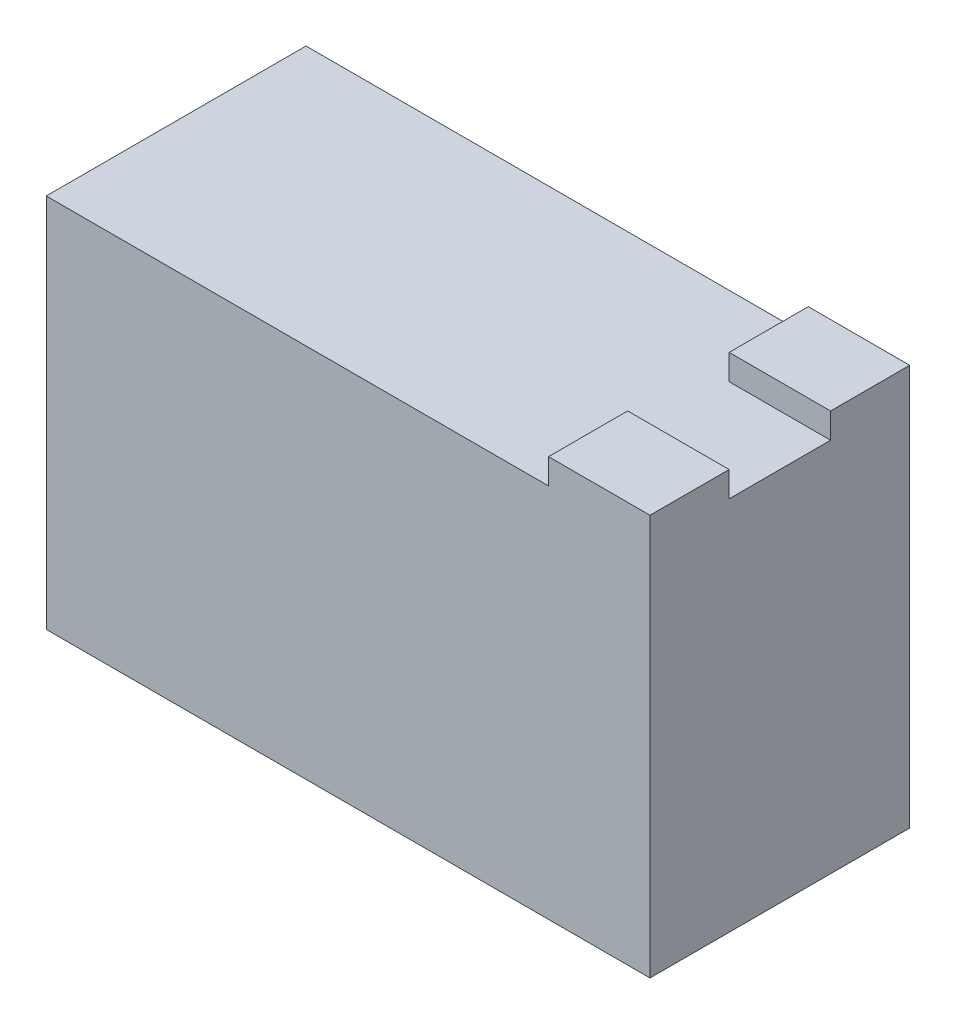
ISO-10303-21;
HEADER;
FILE_DESCRIPTION(('STEP AP214'),'2;1');
FILE_NAME('part.step','',(''),(''),'','','');
FILE_SCHEMA(('AUTOMOTIVE_DESIGN { 1 0 10303 214 1 1 1 1 }'));
ENDSEC;
DATA;
#1=APPLICATION_CONTEXT('core data for automotive mechanical design processes');
#2=APPLICATION_PROTOCOL_DEFINITION('international standard','automotive_design',2000,#1);
#3=PRODUCT_CONTEXT('',#1,'mechanical');
#4=PRODUCT('Part','Part','',(#3));
#5=PRODUCT_RELATED_PRODUCT_CATEGORY('part','',(#4));
#6=PRODUCT_DEFINITION_FORMATION('','',#4);
#7=PRODUCT_DEFINITION_CONTEXT('part definition',#1,'design');
#8=PRODUCT_DEFINITION('design','',#6,#7);
#9=PRODUCT_DEFINITION_SHAPE('','',#8);
#10=(LENGTH_UNIT() NAMED_UNIT(*) SI_UNIT(.MILLI.,.METRE.));
#11=(NAMED_UNIT(*) PLANE_ANGLE_UNIT() SI_UNIT($,.RADIAN.));
#12=(NAMED_UNIT(*) SI_UNIT($,.STERADIAN.) SOLID_ANGLE_UNIT());
#13=UNCERTAINTY_MEASURE_WITH_UNIT(LENGTH_MEASURE(1.E-05),#10,'distance_accuracy_value','');
#14=(GEOMETRIC_REPRESENTATION_CONTEXT(3) GLOBAL_UNCERTAINTY_ASSIGNED_CONTEXT((#13)) GLOBAL_UNIT_ASSIGNED_CONTEXT((#10,
#11,#12)) REPRESENTATION_CONTEXT('',''));
#15=CARTESIAN_POINT('',(0.,0.,0.));
#16=DIRECTION('',(0.,0.,1.));
#17=DIRECTION('',(1.,0.,0.));
#18=AXIS2_PLACEMENT_3D('',#15,#16,#17);
#19=CARTESIAN_POINT('',(0.,93.98,0.));
#20=DIRECTION('',(0.,1.,0.));
#21=DIRECTION('',(0.,0.,1.));
#22=AXIS2_PLACEMENT_3D('',#19,#20,#21);
#23=PLANE('',#22);
#24=DIRECTION('',(1.,0.,0.));
#25=VECTOR('',#24,1.);
#26=CARTESIAN_POINT('',(75.565,93.98,32.512));
#27=LINE('',#26,#25);
#28=CARTESIAN_POINT('',(-75.565,93.98,32.512));
#29=VERTEX_POINT('',#28);
#30=CARTESIAN_POINT('',(50.165,93.98,32.512));
#31=VERTEX_POINT('',#30);
#32=EDGE_CURVE('E218',#29,#31,#27,.T.);
#33=ORIENTED_EDGE('',*,*,#32,.T.);
#34=DIRECTION('',(0.,0.,1.));
#35=VECTOR('',#34,1.);
#36=CARTESIAN_POINT('',(50.165,93.98,12.7));
#37=LINE('',#36,#35);
#38=CARTESIAN_POINT('',(50.165,93.98,12.7));
#39=VERTEX_POINT('',#38);
#40=EDGE_CURVE('E135',#39,#31,#37,.T.);
#41=ORIENTED_EDGE('',*,*,#40,.F.);
#42=DIRECTION('',(-1.,0.,0.));
#43=VECTOR('',#42,1.);
#44=CARTESIAN_POINT('',(50.165,93.98,12.7));
#45=LINE('',#44,#43);
#46=CARTESIAN_POINT('',(75.565,93.98,12.7));
#47=VERTEX_POINT('',#46);
#48=EDGE_CURVE('E131',#47,#39,#45,.T.);
#49=ORIENTED_EDGE('',*,*,#48,.F.);
#50=DIRECTION('',(0.,0.,-1.));
#51=VECTOR('',#50,1.);
#52=CARTESIAN_POINT('',(75.565,93.98,32.512));
#53=LINE('',#52,#51);
#54=CARTESIAN_POINT('',(75.565,93.98,-12.7));
#55=VERTEX_POINT('',#54);
#56=EDGE_CURVE('E37',#47,#55,#53,.T.);
#57=ORIENTED_EDGE('',*,*,#56,.T.);
#58=DIRECTION('',(1.,0.,0.));
#59=VECTOR('',#58,1.);
#60=CARTESIAN_POINT('',(50.165,93.98,-12.7));
#61=LINE('',#60,#59);
#62=CARTESIAN_POINT('',(50.165,93.98,-12.7));
#63=VERTEX_POINT('',#62);
#64=EDGE_CURVE('E138',#63,#55,#61,.T.);
#65=ORIENTED_EDGE('',*,*,#64,.F.);
#66=DIRECTION('',(0.,0.,1.));
#67=VECTOR('',#66,1.);
#68=CARTESIAN_POINT('',(50.165,93.98,-32.512));
#69=LINE('',#68,#67);
#70=CARTESIAN_POINT('',(50.165,93.98,-32.512));
#71=VERTEX_POINT('',#70);
#72=EDGE_CURVE('E59',#71,#63,#69,.T.);
#73=ORIENTED_EDGE('',*,*,#72,.F.);
#74=DIRECTION('',(-1.,0.,0.));
#75=VECTOR('',#74,1.);
#76=CARTESIAN_POINT('',(75.565,93.98,-32.512));
#77=LINE('',#76,#75);
#78=CARTESIAN_POINT('',(-75.565,93.98,-32.512));
#79=VERTEX_POINT('',#78);
#80=EDGE_CURVE('E186',#71,#79,#77,.T.);
#81=ORIENTED_EDGE('',*,*,#80,.T.);
#82=DIRECTION('',(0.,0.,1.));
#83=VECTOR('',#82,1.);
#84=CARTESIAN_POINT('',(-75.565,93.98,32.512));
#85=LINE('',#84,#83);
#86=EDGE_CURVE('E199',#79,#29,#85,.T.);
#87=ORIENTED_EDGE('',*,*,#86,.T.);
#88=EDGE_LOOP('',(#33,#41,#49,#57,#65,#73,#81,#87));
#89=FACE_BOUND('',#88,.T.);
#90=ADVANCED_FACE('F33',(#89),#23,.T.);
#91=CARTESIAN_POINT('',(-75.565,93.98,32.512));
#92=DIRECTION('',(1.,0.,0.));
#93=DIRECTION('',(0.,0.,-1.));
#94=AXIS2_PLACEMENT_3D('',#91,#92,#93);
#95=PLANE('',#94);
#96=DIRECTION('',(0.,0.,1.));
#97=VECTOR('',#96,1.);
#98=CARTESIAN_POINT('',(-75.565,0.,32.512));
#99=LINE('',#98,#97);
#100=CARTESIAN_POINT('',(-75.565,0.,-32.512));
#101=VERTEX_POINT('',#100);
#102=CARTESIAN_POINT('',(-75.565,0.,32.512));
#103=VERTEX_POINT('',#102);
#104=EDGE_CURVE('E176',#101,#103,#99,.T.);
#105=ORIENTED_EDGE('',*,*,#104,.T.);
#106=DIRECTION('',(0.,-1.,0.));
#107=VECTOR('',#106,1.);
#108=CARTESIAN_POINT('',(-75.565,93.98,32.512));
#109=LINE('',#108,#107);
#110=EDGE_CURVE('E11',#29,#103,#109,.T.);
#111=ORIENTED_EDGE('',*,*,#110,.F.);
#112=ORIENTED_EDGE('',*,*,#86,.F.);
#113=DIRECTION('',(0.,-1.,0.));
#114=VECTOR('',#113,1.);
#115=CARTESIAN_POINT('',(-75.565,93.98,-32.512));
#116=LINE('',#115,#114);
#117=EDGE_CURVE('E188',#79,#101,#116,.T.);
#118=ORIENTED_EDGE('',*,*,#117,.T.);
#119=EDGE_LOOP('',(#105,#111,#112,#118));
#120=FACE_BOUND('',#119,.T.);
#121=ADVANCED_FACE('F35',(#120),#95,.F.);
#122=CARTESIAN_POINT('',(75.565,93.98,32.512));
#123=DIRECTION('',(0.,0.,-1.));
#124=DIRECTION('',(-1.,0.,0.));
#125=AXIS2_PLACEMENT_3D('',#122,#123,#124);
#126=PLANE('',#125);
#127=DIRECTION('',(1.,0.,0.));
#128=VECTOR('',#127,1.);
#129=CARTESIAN_POINT('',(75.565,0.,32.512));
#130=LINE('',#129,#128);
#131=CARTESIAN_POINT('',(75.565,0.,32.512));
#132=VERTEX_POINT('',#131);
#133=EDGE_CURVE('E181',#103,#132,#130,.T.);
#134=ORIENTED_EDGE('',*,*,#133,.T.);
#135=DIRECTION('',(0.,-1.,0.));
#136=VECTOR('',#135,1.);
#137=CARTESIAN_POINT('',(75.565,93.98,32.512));
#138=LINE('',#137,#136);
#139=CARTESIAN_POINT('',(75.565,100.33,32.512));
#140=VERTEX_POINT('',#139);
#141=EDGE_CURVE('E43',#140,#132,#138,.T.);
#142=ORIENTED_EDGE('',*,*,#141,.F.);
#143=DIRECTION('',(1.,0.,0.));
#144=VECTOR('',#143,1.);
#145=CARTESIAN_POINT('',(75.565,100.33,32.512));
#146=LINE('',#145,#144);
#147=CARTESIAN_POINT('',(50.165,100.33,32.512));
#148=VERTEX_POINT('',#147);
#149=EDGE_CURVE('E113',#148,#140,#146,.T.);
#150=ORIENTED_EDGE('',*,*,#149,.F.);
#151=DIRECTION('',(0.,-1.,0.));
#152=VECTOR('',#151,1.);
#153=CARTESIAN_POINT('',(50.165,100.33,32.512));
#154=LINE('',#153,#152);
#155=EDGE_CURVE('E117',#148,#31,#154,.T.);
#156=ORIENTED_EDGE('',*,*,#155,.T.);
#157=ORIENTED_EDGE('',*,*,#32,.F.);
#158=ORIENTED_EDGE('',*,*,#110,.T.);
#159=EDGE_LOOP('',(#134,#142,#150,#156,#157,#158));
#160=FACE_BOUND('',#159,.T.);
#161=ADVANCED_FACE('F115',(#160),#126,.F.);
#162=CARTESIAN_POINT('',(75.565,93.98,32.512));
#163=DIRECTION('',(-1.,0.,0.));
#164=DIRECTION('',(0.,0.,1.));
#165=AXIS2_PLACEMENT_3D('',#162,#163,#164);
#166=PLANE('',#165);
#167=DIRECTION('',(0.,0.,-1.));
#168=VECTOR('',#167,1.);
#169=CARTESIAN_POINT('',(75.565,0.,32.512));
#170=LINE('',#169,#168);
#171=CARTESIAN_POINT('',(75.565,0.,-32.512));
#172=VERTEX_POINT('',#171);
#173=EDGE_CURVE('E195',#132,#172,#170,.T.);
#174=ORIENTED_EDGE('',*,*,#173,.T.);
#175=DIRECTION('',(0.,-1.,0.));
#176=VECTOR('',#175,1.);
#177=CARTESIAN_POINT('',(75.565,93.98,-32.512));
#178=LINE('',#177,#176);
#179=CARTESIAN_POINT('',(75.565,100.33,-32.512));
#180=VERTEX_POINT('',#179);
#181=EDGE_CURVE('E202',#180,#172,#178,.T.);
#182=ORIENTED_EDGE('',*,*,#181,.F.);
#183=DIRECTION('',(0.,0.,-1.));
#184=VECTOR('',#183,1.);
#185=CARTESIAN_POINT('',(75.565,100.33,-32.512));
#186=LINE('',#185,#184);
#187=CARTESIAN_POINT('',(75.565,100.33,-12.7));
#188=VERTEX_POINT('',#187);
#189=EDGE_CURVE('E144',#188,#180,#186,.T.);
#190=ORIENTED_EDGE('',*,*,#189,.F.);
#191=DIRECTION('',(0.,-1.,0.));
#192=VECTOR('',#191,1.);
#193=CARTESIAN_POINT('',(75.565,100.33,-12.7));
#194=LINE('',#193,#192);
#195=EDGE_CURVE('E153',#188,#55,#194,.T.);
#196=ORIENTED_EDGE('',*,*,#195,.T.);
#197=ORIENTED_EDGE('',*,*,#56,.F.);
#198=DIRECTION('',(0.,-1.,0.));
#199=VECTOR('',#198,1.);
#200=CARTESIAN_POINT('',(75.565,100.33,12.7));
#201=LINE('',#200,#199);
#202=CARTESIAN_POINT('',(75.565,100.33,12.7));
#203=VERTEX_POINT('',#202);
#204=EDGE_CURVE('E51',#203,#47,#201,.T.);
#205=ORIENTED_EDGE('',*,*,#204,.F.);
#206=DIRECTION('',(0.,0.,-1.));
#207=VECTOR('',#206,1.);
#208=CARTESIAN_POINT('',(75.565,100.33,12.7));
#209=LINE('',#208,#207);
#210=EDGE_CURVE('E122',#140,#203,#209,.T.);
#211=ORIENTED_EDGE('',*,*,#210,.F.);
#212=ORIENTED_EDGE('',*,*,#141,.T.);
#213=EDGE_LOOP('',(#174,#182,#190,#196,#197,#205,#211,#212));
#214=FACE_BOUND('',#213,.T.);
#215=ADVANCED_FACE('F205',(#214),#166,.F.);
#216=CARTESIAN_POINT('',(75.565,93.98,-32.512));
#217=DIRECTION('',(0.,0.,1.));
#218=DIRECTION('',(1.,0.,0.));
#219=AXIS2_PLACEMENT_3D('',#216,#217,#218);
#220=PLANE('',#219);
#221=DIRECTION('',(-1.,0.,0.));
#222=VECTOR('',#221,1.);
#223=CARTESIAN_POINT('',(75.565,0.,-32.512));
#224=LINE('',#223,#222);
#225=EDGE_CURVE('E197',#172,#101,#224,.T.);
#226=ORIENTED_EDGE('',*,*,#225,.T.);
#227=ORIENTED_EDGE('',*,*,#117,.F.);
#228=ORIENTED_EDGE('',*,*,#80,.F.);
#229=DIRECTION('',(0.,-1.,0.));
#230=VECTOR('',#229,1.);
#231=CARTESIAN_POINT('',(50.165,100.33,-32.512));
#232=LINE('',#231,#230);
#233=CARTESIAN_POINT('',(50.165,100.33,-32.512));
#234=VERTEX_POINT('',#233);
#235=EDGE_CURVE('E171',#234,#71,#232,.T.);
#236=ORIENTED_EDGE('',*,*,#235,.F.);
#237=DIRECTION('',(-1.,0.,0.));
#238=VECTOR('',#237,1.);
#239=CARTESIAN_POINT('',(75.565,100.33,-32.512));
#240=LINE('',#239,#238);
#241=EDGE_CURVE('E147',#180,#234,#240,.T.);
#242=ORIENTED_EDGE('',*,*,#241,.F.);
#243=ORIENTED_EDGE('',*,*,#181,.T.);
#244=EDGE_LOOP('',(#226,#227,#228,#236,#242,#243));
#245=FACE_BOUND('',#244,.T.);
#246=ADVANCED_FACE('F212',(#245),#220,.F.);
#247=CARTESIAN_POINT('',(0.,0.,0.));
#248=DIRECTION('',(0.,1.,0.));
#249=DIRECTION('',(0.,0.,1.));
#250=AXIS2_PLACEMENT_3D('',#247,#248,#249);
#251=PLANE('',#250);
#252=ORIENTED_EDGE('',*,*,#104,.F.);
#253=ORIENTED_EDGE('',*,*,#225,.F.);
#254=ORIENTED_EDGE('',*,*,#173,.F.);
#255=ORIENTED_EDGE('',*,*,#133,.F.);
#256=EDGE_LOOP('',(#252,#253,#254,#255));
#257=FACE_BOUND('',#256,.T.);
#258=ADVANCED_FACE('F209',(#257),#251,.F.);
#259=CARTESIAN_POINT('',(50.165,100.33,-32.512));
#260=DIRECTION('',(1.,0.,0.));
#261=DIRECTION('',(0.,0.,-1.));
#262=AXIS2_PLACEMENT_3D('',#259,#260,#261);
#263=PLANE('',#262);
#264=ORIENTED_EDGE('',*,*,#72,.T.);
#265=DIRECTION('',(0.,-1.,0.));
#266=VECTOR('',#265,1.);
#267=CARTESIAN_POINT('',(50.165,100.33,-12.7));
#268=LINE('',#267,#266);
#269=CARTESIAN_POINT('',(50.165,100.33,-12.7));
#270=VERTEX_POINT('',#269);
#271=EDGE_CURVE('E156',#270,#63,#268,.T.);
#272=ORIENTED_EDGE('',*,*,#271,.F.);
#273=DIRECTION('',(0.,0.,1.));
#274=VECTOR('',#273,1.);
#275=CARTESIAN_POINT('',(50.165,100.33,-32.512));
#276=LINE('',#275,#274);
#277=EDGE_CURVE('E149',#234,#270,#276,.T.);
#278=ORIENTED_EDGE('',*,*,#277,.F.);
#279=ORIENTED_EDGE('',*,*,#235,.T.);
#280=EDGE_LOOP('',(#264,#272,#278,#279));
#281=FACE_BOUND('',#280,.T.);
#282=ADVANCED_FACE('F222',(#281),#263,.F.);
#283=CARTESIAN_POINT('',(50.165,100.33,-12.7));
#284=DIRECTION('',(0.,0.,-1.));
#285=DIRECTION('',(-1.,0.,0.));
#286=AXIS2_PLACEMENT_3D('',#283,#284,#285);
#287=PLANE('',#286);
#288=ORIENTED_EDGE('',*,*,#64,.T.);
#289=ORIENTED_EDGE('',*,*,#195,.F.);
#290=DIRECTION('',(1.,0.,0.));
#291=VECTOR('',#290,1.);
#292=CARTESIAN_POINT('',(50.165,100.33,-12.7));
#293=LINE('',#292,#291);
#294=EDGE_CURVE('E151',#270,#188,#293,.T.);
#295=ORIENTED_EDGE('',*,*,#294,.F.);
#296=ORIENTED_EDGE('',*,*,#271,.T.);
#297=EDGE_LOOP('',(#288,#289,#295,#296));
#298=FACE_BOUND('',#297,.T.);
#299=ADVANCED_FACE('F219',(#298),#287,.F.);
#300=CARTESIAN_POINT('',(0.,100.33,0.));
#301=DIRECTION('',(0.,1.,0.));
#302=DIRECTION('',(0.,0.,1.));
#303=AXIS2_PLACEMENT_3D('',#300,#301,#302);
#304=PLANE('',#303);
#305=ORIENTED_EDGE('',*,*,#189,.T.);
#306=ORIENTED_EDGE('',*,*,#241,.T.);
#307=ORIENTED_EDGE('',*,*,#277,.T.);
#308=ORIENTED_EDGE('',*,*,#294,.T.);
#309=EDGE_LOOP('',(#305,#306,#307,#308));
#310=FACE_BOUND('',#309,.T.);
#311=ADVANCED_FACE('F221',(#310),#304,.T.);
#312=CARTESIAN_POINT('',(50.165,100.33,12.7));
#313=DIRECTION('',(1.,0.,0.));
#314=DIRECTION('',(0.,0.,-1.));
#315=AXIS2_PLACEMENT_3D('',#312,#313,#314);
#316=PLANE('',#315);
#317=ORIENTED_EDGE('',*,*,#40,.T.);
#318=ORIENTED_EDGE('',*,*,#155,.F.);
#319=DIRECTION('',(0.,0.,1.));
#320=VECTOR('',#319,1.);
#321=CARTESIAN_POINT('',(50.165,100.33,12.7));
#322=LINE('',#321,#320);
#323=CARTESIAN_POINT('',(50.165,100.33,12.7));
#324=VERTEX_POINT('',#323);
#325=EDGE_CURVE('E123',#324,#148,#322,.T.);
#326=ORIENTED_EDGE('',*,*,#325,.F.);
#327=DIRECTION('',(0.,-1.,0.));
#328=VECTOR('',#327,1.);
#329=CARTESIAN_POINT('',(50.165,100.33,12.7));
#330=LINE('',#329,#328);
#331=EDGE_CURVE('E140',#324,#39,#330,.T.);
#332=ORIENTED_EDGE('',*,*,#331,.T.);
#333=EDGE_LOOP('',(#317,#318,#326,#332));
#334=FACE_BOUND('',#333,.T.);
#335=ADVANCED_FACE('F133',(#334),#316,.F.);
#336=CARTESIAN_POINT('',(50.165,100.33,12.7));
#337=DIRECTION('',(0.,0.,1.));
#338=DIRECTION('',(1.,0.,0.));
#339=AXIS2_PLACEMENT_3D('',#336,#337,#338);
#340=PLANE('',#339);
#341=ORIENTED_EDGE('',*,*,#48,.T.);
#342=ORIENTED_EDGE('',*,*,#331,.F.);
#343=DIRECTION('',(-1.,0.,0.));
#344=VECTOR('',#343,1.);
#345=CARTESIAN_POINT('',(50.165,100.33,12.7));
#346=LINE('',#345,#344);
#347=EDGE_CURVE('E127',#203,#324,#346,.T.);
#348=ORIENTED_EDGE('',*,*,#347,.F.);
#349=ORIENTED_EDGE('',*,*,#204,.T.);
#350=EDGE_LOOP('',(#341,#342,#348,#349));
#351=FACE_BOUND('',#350,.T.);
#352=ADVANCED_FACE('F307',(#351),#340,.F.);
#353=CARTESIAN_POINT('',(0.,100.33,0.));
#354=DIRECTION('',(0.,-1.,0.));
#355=DIRECTION('',(0.,0.,-1.));
#356=AXIS2_PLACEMENT_3D('',#353,#354,#355);
#357=PLANE('',#356);
#358=ORIENTED_EDGE('',*,*,#325,.T.);
#359=ORIENTED_EDGE('',*,*,#149,.T.);
#360=ORIENTED_EDGE('',*,*,#210,.T.);
#361=ORIENTED_EDGE('',*,*,#347,.T.);
#362=EDGE_LOOP('',(#358,#359,#360,#361));
#363=FACE_BOUND('',#362,.T.);
#364=ADVANCED_FACE('F126',(#363),#357,.F.);
#365=CLOSED_SHELL('',(#90,#121,#161,#215,#246,#258,#282,#299,#311,#335,#352,#364));
#366=MANIFOLD_SOLID_BREP('B2',#365);
#367=ADVANCED_BREP_SHAPE_REPRESENTATION('',(#18,#366),#14);
#368=SHAPE_DEFINITION_REPRESENTATION(#9,#367);
ENDSEC;
END-ISO-10303-21;
